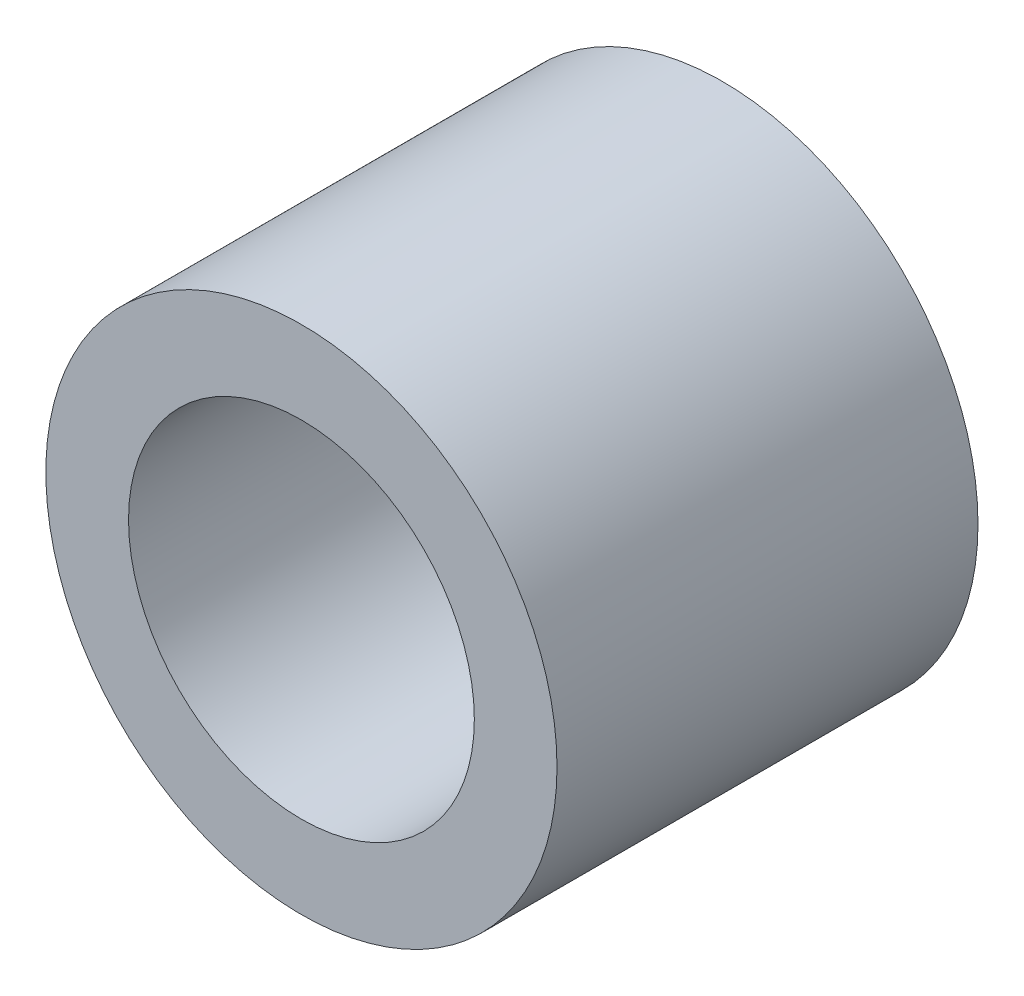
ISO-10303-21;
HEADER;
FILE_DESCRIPTION(('STEP AP214'),'2;1');
FILE_NAME('part.step','',(''),(''),'','','');
FILE_SCHEMA(('AUTOMOTIVE_DESIGN { 1 0 10303 214 1 1 1 1 }'));
ENDSEC;
DATA;
#1=APPLICATION_CONTEXT('core data for automotive mechanical design processes');
#2=APPLICATION_PROTOCOL_DEFINITION('international standard','automotive_design',2000,#1);
#3=PRODUCT_CONTEXT('',#1,'mechanical');
#4=PRODUCT('Part','Part','',(#3));
#5=PRODUCT_RELATED_PRODUCT_CATEGORY('part','',(#4));
#6=PRODUCT_DEFINITION_FORMATION('','',#4);
#7=PRODUCT_DEFINITION_CONTEXT('part definition',#1,'design');
#8=PRODUCT_DEFINITION('design','',#6,#7);
#9=PRODUCT_DEFINITION_SHAPE('','',#8);
#10=(LENGTH_UNIT() NAMED_UNIT(*) SI_UNIT(.MILLI.,.METRE.));
#11=(NAMED_UNIT(*) PLANE_ANGLE_UNIT() SI_UNIT($,.RADIAN.));
#12=(NAMED_UNIT(*) SI_UNIT($,.STERADIAN.) SOLID_ANGLE_UNIT());
#13=UNCERTAINTY_MEASURE_WITH_UNIT(LENGTH_MEASURE(1.E-05),#10,'distance_accuracy_value','');
#14=(GEOMETRIC_REPRESENTATION_CONTEXT(3) GLOBAL_UNCERTAINTY_ASSIGNED_CONTEXT((#13)) GLOBAL_UNIT_ASSIGNED_CONTEXT((#10,
#11,#12)) REPRESENTATION_CONTEXT('',''));
#15=CARTESIAN_POINT('',(0.,0.,0.));
#16=DIRECTION('',(0.,0.,1.));
#17=DIRECTION('',(1.,0.,0.));
#18=AXIS2_PLACEMENT_3D('',#15,#16,#17);
#19=CARTESIAN_POINT('',(0.,0.,2.8));
#20=DIRECTION('',(0.,0.,1.));
#21=DIRECTION('',(1.,0.,0.));
#22=AXIS2_PLACEMENT_3D('',#19,#20,#21);
#23=PLANE('',#22);
#24=CARTESIAN_POINT('',(0.,0.,2.8));
#25=DIRECTION('',(0.,0.,1.));
#26=DIRECTION('',(1.,0.,0.));
#27=AXIS2_PLACEMENT_3D('',#24,#25,#26);
#28=CIRCLE('',#27,3.4);
#29=CARTESIAN_POINT('',(3.4,0.,2.8));
#30=VERTEX_POINT('',#29);
#31=EDGE_CURVE('E10',#30,#30,#28,.T.);
#32=ORIENTED_EDGE('',*,*,#31,.T.);
#33=EDGE_LOOP('',(#32));
#34=FACE_BOUND('',#33,.T.);
#35=CARTESIAN_POINT('',(0.,0.,2.8));
#36=DIRECTION('',(0.,0.,1.));
#37=DIRECTION('',(1.,0.,0.));
#38=AXIS2_PLACEMENT_3D('',#35,#36,#37);
#39=CIRCLE('',#38,2.3);
#40=CARTESIAN_POINT('',(2.3,0.,2.8));
#41=VERTEX_POINT('',#40);
#42=EDGE_CURVE('E42',#41,#41,#39,.T.);
#43=ORIENTED_EDGE('',*,*,#42,.F.);
#44=EDGE_LOOP('',(#43));
#45=FACE_BOUND('',#44,.T.);
#46=ADVANCED_FACE('F31',(#34,#45),#23,.T.);
#47=CARTESIAN_POINT('',(0.,0.,-2.8));
#48=DIRECTION('',(0.,0.,1.));
#49=DIRECTION('',(1.,0.,0.));
#50=AXIS2_PLACEMENT_3D('',#47,#48,#49);
#51=PLANE('',#50);
#52=CARTESIAN_POINT('',(0.,0.,-2.8));
#53=DIRECTION('',(0.,0.,1.));
#54=DIRECTION('',(1.,0.,0.));
#55=AXIS2_PLACEMENT_3D('',#52,#53,#54);
#56=CIRCLE('',#55,3.4);
#57=CARTESIAN_POINT('',(3.4,0.,-2.8));
#58=VERTEX_POINT('',#57);
#59=EDGE_CURVE('E35',#58,#58,#56,.T.);
#60=ORIENTED_EDGE('',*,*,#59,.F.);
#61=EDGE_LOOP('',(#60));
#62=FACE_BOUND('',#61,.T.);
#63=CARTESIAN_POINT('',(0.,0.,-2.8));
#64=DIRECTION('',(0.,0.,1.));
#65=DIRECTION('',(1.,0.,0.));
#66=AXIS2_PLACEMENT_3D('',#63,#64,#65);
#67=CIRCLE('',#66,2.3);
#68=CARTESIAN_POINT('',(2.3,0.,-2.8));
#69=VERTEX_POINT('',#68);
#70=EDGE_CURVE('E44',#69,#69,#67,.T.);
#71=ORIENTED_EDGE('',*,*,#70,.T.);
#72=EDGE_LOOP('',(#71));
#73=FACE_BOUND('',#72,.T.);
#74=ADVANCED_FACE('F54',(#62,#73),#51,.F.);
#75=CARTESIAN_POINT('',(0.,0.,2.8));
#76=DIRECTION('',(0.,0.,-1.));
#77=DIRECTION('',(-1.,0.,0.));
#78=AXIS2_PLACEMENT_3D('',#75,#76,#77);
#79=CYLINDRICAL_SURFACE('',#78,3.4);
#80=ORIENTED_EDGE('',*,*,#31,.F.);
#81=EDGE_LOOP('',(#80));
#82=FACE_BOUND('',#81,.T.);
#83=ORIENTED_EDGE('',*,*,#59,.T.);
#84=EDGE_LOOP('',(#83));
#85=FACE_BOUND('',#84,.T.);
#86=ADVANCED_FACE('F33',(#82,#85),#79,.T.);
#87=CARTESIAN_POINT('',(0.,0.,2.8));
#88=DIRECTION('',(0.,0.,-1.));
#89=DIRECTION('',(-1.,0.,0.));
#90=AXIS2_PLACEMENT_3D('',#87,#88,#89);
#91=CYLINDRICAL_SURFACE('',#90,2.3);
#92=ORIENTED_EDGE('',*,*,#42,.T.);
#93=EDGE_LOOP('',(#92));
#94=FACE_BOUND('',#93,.T.);
#95=ORIENTED_EDGE('',*,*,#70,.F.);
#96=EDGE_LOOP('',(#95));
#97=FACE_BOUND('',#96,.T.);
#98=ADVANCED_FACE('F50',(#94,#97),#91,.F.);
#99=CLOSED_SHELL('',(#46,#74,#86,#98));
#100=MANIFOLD_SOLID_BREP('B2',#99);
#101=ADVANCED_BREP_SHAPE_REPRESENTATION('',(#18,#100),#14);
#102=SHAPE_DEFINITION_REPRESENTATION(#9,#101);
ENDSEC;
END-ISO-10303-21;
